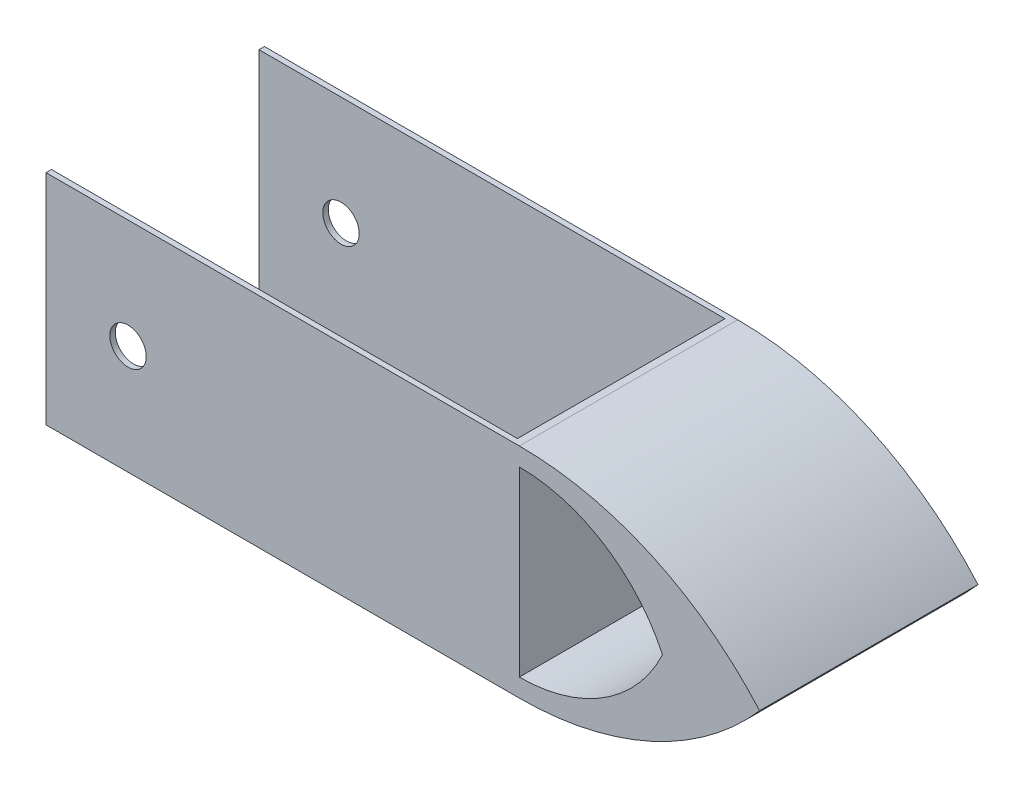
ISO-10303-21;
HEADER;
FILE_DESCRIPTION(('STEP AP214'),'2;1');
FILE_NAME('part.step','',(''),(''),'','','');
FILE_SCHEMA(('AUTOMOTIVE_DESIGN { 1 0 10303 214 1 1 1 1 }'));
ENDSEC;
DATA;
#1=APPLICATION_CONTEXT('core data for automotive mechanical design processes');
#2=APPLICATION_PROTOCOL_DEFINITION('international standard','automotive_design',2000,#1);
#3=PRODUCT_CONTEXT('',#1,'mechanical');
#4=PRODUCT('Part','Part','',(#3));
#5=PRODUCT_RELATED_PRODUCT_CATEGORY('part','',(#4));
#6=PRODUCT_DEFINITION_FORMATION('','',#4);
#7=PRODUCT_DEFINITION_CONTEXT('part definition',#1,'design');
#8=PRODUCT_DEFINITION('design','',#6,#7);
#9=PRODUCT_DEFINITION_SHAPE('','',#8);
#10=(LENGTH_UNIT() NAMED_UNIT(*) SI_UNIT(.MILLI.,.METRE.));
#11=(NAMED_UNIT(*) PLANE_ANGLE_UNIT() SI_UNIT($,.RADIAN.));
#12=(NAMED_UNIT(*) SI_UNIT($,.STERADIAN.) SOLID_ANGLE_UNIT());
#13=UNCERTAINTY_MEASURE_WITH_UNIT(LENGTH_MEASURE(1.E-05),#10,'distance_accuracy_value','');
#14=(GEOMETRIC_REPRESENTATION_CONTEXT(3) GLOBAL_UNCERTAINTY_ASSIGNED_CONTEXT((#13)) GLOBAL_UNIT_ASSIGNED_CONTEXT((#10,
#11,#12)) REPRESENTATION_CONTEXT('',''));
#15=CARTESIAN_POINT('',(0.,0.,0.));
#16=DIRECTION('',(0.,0.,1.));
#17=DIRECTION('',(1.,0.,0.));
#18=AXIS2_PLACEMENT_3D('',#15,#16,#17);
#19=CARTESIAN_POINT('',(-65.,30.,60.));
#20=DIRECTION('',(1.,0.,0.));
#21=DIRECTION('',(0.,1.,0.));
#22=AXIS2_PLACEMENT_3D('',#19,#20,#21);
#23=PLANE('',#22);
#24=DIRECTION('',(0.,0.,-1.));
#25=VECTOR('',#24,1.);
#26=CARTESIAN_POINT('',(-65.,-30.,60.));
#27=LINE('',#26,#25);
#28=CARTESIAN_POINT('',(-65.,-30.,1.50000000000002));
#29=VERTEX_POINT('',#28);
#30=CARTESIAN_POINT('',(-65.,-30.,0.));
#31=VERTEX_POINT('',#30);
#32=EDGE_CURVE('E178',#29,#31,#27,.T.);
#33=ORIENTED_EDGE('',*,*,#32,.F.);
#34=DIRECTION('',(0.,1.,0.));
#35=VECTOR('',#34,1.);
#36=CARTESIAN_POINT('',(-65.,30.,1.50000000000002));
#37=LINE('',#36,#35);
#38=CARTESIAN_POINT('',(-65.,30.,1.50000000000002));
#39=VERTEX_POINT('',#38);
#40=EDGE_CURVE('E133',#29,#39,#37,.T.);
#41=ORIENTED_EDGE('',*,*,#40,.T.);
#42=DIRECTION('',(0.,0.,-1.));
#43=VECTOR('',#42,1.);
#44=CARTESIAN_POINT('',(-65.,30.,60.));
#45=LINE('',#44,#43);
#46=CARTESIAN_POINT('',(-65.,30.,0.));
#47=VERTEX_POINT('',#46);
#48=EDGE_CURVE('E126',#39,#47,#45,.T.);
#49=ORIENTED_EDGE('',*,*,#48,.T.);
#50=DIRECTION('',(0.,-1.,0.));
#51=VECTOR('',#50,1.);
#52=CARTESIAN_POINT('',(-65.,30.,0.));
#53=LINE('',#52,#51);
#54=EDGE_CURVE('E130',#47,#31,#53,.T.);
#55=ORIENTED_EDGE('',*,*,#54,.T.);
#56=EDGE_LOOP('',(#33,#41,#49,#55));
#57=FACE_BOUND('',#56,.T.);
#58=ADVANCED_FACE('F38',(#57),#23,.F.);
#59=CARTESIAN_POINT('',(-65.,30.,60.));
#60=VERTEX_POINT('',#59);
#61=CARTESIAN_POINT('',(-65.,30.,58.5));
#62=VERTEX_POINT('',#61);
#63=EDGE_CURVE('E137',#60,#62,#45,.T.);
#64=ORIENTED_EDGE('',*,*,#63,.T.);
#65=DIRECTION('',(0.,-1.,0.));
#66=VECTOR('',#65,1.);
#67=CARTESIAN_POINT('',(-65.,30.,58.5));
#68=LINE('',#67,#66);
#69=CARTESIAN_POINT('',(-65.,-30.,58.5));
#70=VERTEX_POINT('',#69);
#71=EDGE_CURVE('E243',#62,#70,#68,.T.);
#72=ORIENTED_EDGE('',*,*,#71,.T.);
#73=CARTESIAN_POINT('',(-65.,-30.,60.));
#74=VERTEX_POINT('',#73);
#75=EDGE_CURVE('E179',#74,#70,#27,.T.);
#76=ORIENTED_EDGE('',*,*,#75,.F.);
#77=DIRECTION('',(0.,-1.,0.));
#78=VECTOR('',#77,1.);
#79=CARTESIAN_POINT('',(-65.,30.,60.));
#80=LINE('',#79,#78);
#81=EDGE_CURVE('E147',#60,#74,#80,.T.);
#82=ORIENTED_EDGE('',*,*,#81,.F.);
#83=EDGE_LOOP('',(#64,#72,#76,#82));
#84=FACE_BOUND('',#83,.T.);
#85=ADVANCED_FACE('F40',(#84),#23,.F.);
#86=CARTESIAN_POINT('',(65.,-30.,60.));
#87=DIRECTION('',(0.,1.,0.));
#88=DIRECTION('',(-1.,0.,0.));
#89=AXIS2_PLACEMENT_3D('',#86,#87,#88);
#90=PLANE('',#89);
#91=DIRECTION('',(-1.,0.,0.));
#92=VECTOR('',#91,1.);
#93=CARTESIAN_POINT('',(63.,-30.,1.5));
#94=LINE('',#93,#92);
#95=CARTESIAN_POINT('',(63.,-30.,1.5));
#96=VERTEX_POINT('',#95);
#97=EDGE_CURVE('E267',#96,#29,#94,.T.);
#98=ORIENTED_EDGE('',*,*,#97,.T.);
#99=ORIENTED_EDGE('',*,*,#32,.T.);
#100=DIRECTION('',(1.,0.,0.));
#101=VECTOR('',#100,1.);
#102=CARTESIAN_POINT('',(65.,-30.,0.));
#103=LINE('',#102,#101);
#104=CARTESIAN_POINT('',(65.,-30.,0.));
#105=VERTEX_POINT('',#104);
#106=EDGE_CURVE('E152',#31,#105,#103,.T.);
#107=ORIENTED_EDGE('',*,*,#106,.T.);
#108=DIRECTION('',(0.,0.,-1.));
#109=VECTOR('',#108,1.);
#110=CARTESIAN_POINT('',(65.,-30.,60.));
#111=LINE('',#110,#109);
#112=CARTESIAN_POINT('',(65.,-30.,60.));
#113=VERTEX_POINT('',#112);
#114=EDGE_CURVE('E174',#113,#105,#111,.T.);
#115=ORIENTED_EDGE('',*,*,#114,.F.);
#116=DIRECTION('',(1.,0.,0.));
#117=VECTOR('',#116,1.);
#118=CARTESIAN_POINT('',(65.,-30.,60.));
#119=LINE('',#118,#117);
#120=EDGE_CURVE('E222',#74,#113,#119,.T.);
#121=ORIENTED_EDGE('',*,*,#120,.F.);
#122=ORIENTED_EDGE('',*,*,#75,.T.);
#123=DIRECTION('',(1.,0.,0.));
#124=VECTOR('',#123,1.);
#125=CARTESIAN_POINT('',(63.,-30.,58.5));
#126=LINE('',#125,#124);
#127=CARTESIAN_POINT('',(63.,-30.,58.5));
#128=VERTEX_POINT('',#127);
#129=EDGE_CURVE('E249',#70,#128,#126,.T.);
#130=ORIENTED_EDGE('',*,*,#129,.T.);
#131=DIRECTION('',(0.,0.,-1.));
#132=VECTOR('',#131,1.);
#133=CARTESIAN_POINT('',(63.,-30.,1.5));
#134=LINE('',#133,#132);
#135=EDGE_CURVE('E56',#128,#96,#134,.T.);
#136=ORIENTED_EDGE('',*,*,#135,.T.);
#137=EDGE_LOOP('',(#98,#99,#107,#115,#121,#122,#130,#136));
#138=FACE_BOUND('',#137,.T.);
#139=ADVANCED_FACE('F247',(#138),#90,.F.);
#140=CARTESIAN_POINT('',(65.,57.5848954122928,60.));
#141=DIRECTION('',(0.,0.,-1.));
#142=DIRECTION('',(-1.,0.,0.));
#143=AXIS2_PLACEMENT_3D('',#140,#141,#142);
#144=CYLINDRICAL_SURFACE('',#143,87.5848954122928);
#145=CARTESIAN_POINT('',(65.,57.5848954122928,0.));
#146=DIRECTION('',(0.,0.,1.));
#147=DIRECTION('',(1.,0.,0.));
#148=AXIS2_PLACEMENT_3D('',#145,#146,#147);
#149=CIRCLE('',#148,87.5848954122928);
#150=CARTESIAN_POINT('',(130.993133921171,0.,0.));
#151=VERTEX_POINT('',#150);
#152=EDGE_CURVE('E157',#105,#151,#149,.T.);
#153=ORIENTED_EDGE('',*,*,#152,.T.);
#154=DIRECTION('',(0.,0.,-1.));
#155=VECTOR('',#154,1.);
#156=CARTESIAN_POINT('',(130.993133921171,0.,60.));
#157=LINE('',#156,#155);
#158=CARTESIAN_POINT('',(130.993133921171,0.,60.));
#159=VERTEX_POINT('',#158);
#160=EDGE_CURVE('E171',#159,#151,#157,.T.);
#161=ORIENTED_EDGE('',*,*,#160,.F.);
#162=CARTESIAN_POINT('',(65.,57.5848954122928,60.));
#163=DIRECTION('',(0.,0.,1.));
#164=DIRECTION('',(1.,0.,0.));
#165=AXIS2_PLACEMENT_3D('',#162,#163,#164);
#166=CIRCLE('',#165,87.5848954122928);
#167=EDGE_CURVE('E225',#113,#159,#166,.T.);
#168=ORIENTED_EDGE('',*,*,#167,.F.);
#169=ORIENTED_EDGE('',*,*,#114,.T.);
#170=EDGE_LOOP('',(#153,#161,#168,#169));
#171=FACE_BOUND('',#170,.T.);
#172=ADVANCED_FACE('F328',(#171),#144,.T.);
#173=CARTESIAN_POINT('',(65.,-57.5848954122928,60.));
#174=DIRECTION('',(0.,0.,-1.));
#175=DIRECTION('',(-1.,0.,0.));
#176=AXIS2_PLACEMENT_3D('',#173,#174,#175);
#177=CYLINDRICAL_SURFACE('',#176,87.5848954122928);
#178=CARTESIAN_POINT('',(65.,-57.5848954122928,0.));
#179=DIRECTION('',(0.,0.,1.));
#180=DIRECTION('',(-1.,0.,0.));
#181=AXIS2_PLACEMENT_3D('',#178,#179,#180);
#182=CIRCLE('',#181,87.5848954122928);
#183=CARTESIAN_POINT('',(65.,30.,0.));
#184=VERTEX_POINT('',#183);
#185=EDGE_CURVE('E119',#151,#184,#182,.T.);
#186=ORIENTED_EDGE('',*,*,#185,.T.);
#187=DIRECTION('',(0.,0.,-1.));
#188=VECTOR('',#187,1.);
#189=CARTESIAN_POINT('',(65.,30.,60.));
#190=LINE('',#189,#188);
#191=CARTESIAN_POINT('',(65.,30.,60.));
#192=VERTEX_POINT('',#191);
#193=EDGE_CURVE('E144',#192,#184,#190,.T.);
#194=ORIENTED_EDGE('',*,*,#193,.F.);
#195=CARTESIAN_POINT('',(65.,-57.5848954122928,60.));
#196=DIRECTION('',(0.,0.,1.));
#197=DIRECTION('',(-1.,0.,0.));
#198=AXIS2_PLACEMENT_3D('',#195,#196,#197);
#199=CIRCLE('',#198,87.5848954122928);
#200=EDGE_CURVE('E227',#159,#192,#199,.T.);
#201=ORIENTED_EDGE('',*,*,#200,.F.);
#202=ORIENTED_EDGE('',*,*,#160,.T.);
#203=EDGE_LOOP('',(#186,#194,#201,#202));
#204=FACE_BOUND('',#203,.T.);
#205=ADVANCED_FACE('F333',(#204),#177,.T.);
#206=CARTESIAN_POINT('',(65.,30.,60.));
#207=DIRECTION('',(0.,-1.,0.));
#208=DIRECTION('',(1.,0.,0.));
#209=AXIS2_PLACEMENT_3D('',#206,#207,#208);
#210=PLANE('',#209);
#211=ORIENTED_EDGE('',*,*,#48,.F.);
#212=DIRECTION('',(-1.,0.,0.));
#213=VECTOR('',#212,1.);
#214=CARTESIAN_POINT('',(63.,30.,1.5));
#215=LINE('',#214,#213);
#216=CARTESIAN_POINT('',(63.,30.,1.5));
#217=VERTEX_POINT('',#216);
#218=EDGE_CURVE('E274',#217,#39,#215,.T.);
#219=ORIENTED_EDGE('',*,*,#218,.F.);
#220=DIRECTION('',(0.,0.,-1.));
#221=VECTOR('',#220,1.);
#222=CARTESIAN_POINT('',(63.,30.,1.5));
#223=LINE('',#222,#221);
#224=CARTESIAN_POINT('',(63.,30.,58.5));
#225=VERTEX_POINT('',#224);
#226=EDGE_CURVE('E264',#225,#217,#223,.T.);
#227=ORIENTED_EDGE('',*,*,#226,.F.);
#228=DIRECTION('',(1.,0.,0.));
#229=VECTOR('',#228,1.);
#230=CARTESIAN_POINT('',(63.,30.,58.5));
#231=LINE('',#230,#229);
#232=EDGE_CURVE('E238',#62,#225,#231,.T.);
#233=ORIENTED_EDGE('',*,*,#232,.F.);
#234=ORIENTED_EDGE('',*,*,#63,.F.);
#235=DIRECTION('',(-1.,0.,0.));
#236=VECTOR('',#235,1.);
#237=CARTESIAN_POINT('',(65.,30.,60.));
#238=LINE('',#237,#236);
#239=EDGE_CURVE('E138',#192,#60,#238,.T.);
#240=ORIENTED_EDGE('',*,*,#239,.F.);
#241=ORIENTED_EDGE('',*,*,#193,.T.);
#242=DIRECTION('',(-1.,0.,0.));
#243=VECTOR('',#242,1.);
#244=CARTESIAN_POINT('',(65.,30.,0.));
#245=LINE('',#244,#243);
#246=EDGE_CURVE('E141',#184,#47,#245,.T.);
#247=ORIENTED_EDGE('',*,*,#246,.T.);
#248=EDGE_LOOP('',(#211,#219,#227,#233,#234,#240,#241,#247));
#249=FACE_BOUND('',#248,.T.);
#250=ADVANCED_FACE('F142',(#249),#210,.F.);
#251=CARTESIAN_POINT('',(65.,57.5848954122928,60.));
#252=DIRECTION('',(0.,0.,1.));
#253=DIRECTION('',(1.,0.,0.));
#254=AXIS2_PLACEMENT_3D('',#251,#252,#253);
#255=PLANE('',#254);
#256=CARTESIAN_POINT('',(-42.4670371060077,0.,60.));
#257=DIRECTION('',(0.,0.,1.));
#258=DIRECTION('',(1.,0.,0.));
#259=AXIS2_PLACEMENT_3D('',#256,#257,#258);
#260=CIRCLE('',#259,5.);
#261=CARTESIAN_POINT('',(-37.4670371060077,0.,60.));
#262=VERTEX_POINT('',#261);
#263=EDGE_CURVE('E295',#262,#262,#260,.T.);
#264=ORIENTED_EDGE('',*,*,#263,.F.);
#265=EDGE_LOOP('',(#264));
#266=FACE_BOUND('',#265,.T.);
#267=CARTESIAN_POINT('',(65.,-18.4515973099155,60.));
#268=DIRECTION('',(0.,0.,1.));
#269=DIRECTION('',(-1.,0.,0.));
#270=AXIS2_PLACEMENT_3D('',#267,#268,#269);
#271=CIRCLE('',#270,43.4515973099155);
#272=CARTESIAN_POINT('',(104.339291624224,0.,60.));
#273=VERTEX_POINT('',#272);
#274=CARTESIAN_POINT('',(65.,25.,60.));
#275=VERTEX_POINT('',#274);
#276=EDGE_CURVE('E201',#273,#275,#271,.T.);
#277=ORIENTED_EDGE('',*,*,#276,.F.);
#278=CARTESIAN_POINT('',(64.9999999999999,18.4515973099155,60.));
#279=DIRECTION('',(0.,0.,1.));
#280=DIRECTION('',(1.,0.,0.));
#281=AXIS2_PLACEMENT_3D('',#278,#279,#280);
#282=CIRCLE('',#281,43.4515973099155);
#283=CARTESIAN_POINT('',(65.,-25.,60.));
#284=VERTEX_POINT('',#283);
#285=EDGE_CURVE('E193',#284,#273,#282,.T.);
#286=ORIENTED_EDGE('',*,*,#285,.F.);
#287=DIRECTION('',(0.,-1.,0.));
#288=VECTOR('',#287,1.);
#289=CARTESIAN_POINT('',(65.,25.,60.));
#290=LINE('',#289,#288);
#291=EDGE_CURVE('E199',#275,#284,#290,.T.);
#292=ORIENTED_EDGE('',*,*,#291,.F.);
#293=EDGE_LOOP('',(#277,#286,#292));
#294=FACE_BOUND('',#293,.T.);
#295=ORIENTED_EDGE('',*,*,#81,.T.);
#296=ORIENTED_EDGE('',*,*,#120,.T.);
#297=ORIENTED_EDGE('',*,*,#167,.T.);
#298=ORIENTED_EDGE('',*,*,#200,.T.);
#299=ORIENTED_EDGE('',*,*,#239,.T.);
#300=EDGE_LOOP('',(#295,#296,#297,#298,#299));
#301=FACE_BOUND('',#300,.T.);
#302=ADVANCED_FACE('F202',(#266,#294,#301),#255,.T.);
#303=CARTESIAN_POINT('',(65.,57.5848954122928,0.));
#304=DIRECTION('',(0.,0.,1.));
#305=DIRECTION('',(1.,0.,0.));
#306=AXIS2_PLACEMENT_3D('',#303,#304,#305);
#307=PLANE('',#306);
#308=CARTESIAN_POINT('',(-42.4670371060077,0.,0.));
#309=DIRECTION('',(0.,0.,1.));
#310=DIRECTION('',(1.,0.,0.));
#311=AXIS2_PLACEMENT_3D('',#308,#309,#310);
#312=CIRCLE('',#311,5.);
#313=CARTESIAN_POINT('',(-37.4670371060077,0.,0.));
#314=VERTEX_POINT('',#313);
#315=EDGE_CURVE('E287',#314,#314,#312,.F.);
#316=ORIENTED_EDGE('',*,*,#315,.F.);
#317=EDGE_LOOP('',(#316));
#318=FACE_BOUND('',#317,.T.);
#319=CARTESIAN_POINT('',(64.9999999999999,18.4515973099155,0.));
#320=DIRECTION('',(0.,0.,1.));
#321=DIRECTION('',(1.,0.,0.));
#322=AXIS2_PLACEMENT_3D('',#319,#320,#321);
#323=CIRCLE('',#322,43.4515973099155);
#324=CARTESIAN_POINT('',(65.,-25.,0.));
#325=VERTEX_POINT('',#324);
#326=CARTESIAN_POINT('',(104.339291624224,0.,0.));
#327=VERTEX_POINT('',#326);
#328=EDGE_CURVE('E48',#325,#327,#323,.T.);
#329=ORIENTED_EDGE('',*,*,#328,.T.);
#330=CARTESIAN_POINT('',(65.,-18.4515973099155,0.));
#331=DIRECTION('',(0.,0.,1.));
#332=DIRECTION('',(1.,0.,0.));
#333=AXIS2_PLACEMENT_3D('',#330,#331,#332);
#334=CIRCLE('',#333,43.4515973099155);
#335=CARTESIAN_POINT('',(65.,25.,0.));
#336=VERTEX_POINT('',#335);
#337=EDGE_CURVE('E11',#327,#336,#334,.T.);
#338=ORIENTED_EDGE('',*,*,#337,.T.);
#339=DIRECTION('',(0.,1.,0.));
#340=VECTOR('',#339,1.);
#341=CARTESIAN_POINT('',(65.,57.5848954122928,0.));
#342=LINE('',#341,#340);
#343=EDGE_CURVE('E77',#336,#325,#342,.F.);
#344=ORIENTED_EDGE('',*,*,#343,.T.);
#345=EDGE_LOOP('',(#329,#338,#344));
#346=FACE_BOUND('',#345,.T.);
#347=ORIENTED_EDGE('',*,*,#54,.F.);
#348=ORIENTED_EDGE('',*,*,#246,.F.);
#349=ORIENTED_EDGE('',*,*,#185,.F.);
#350=ORIENTED_EDGE('',*,*,#152,.F.);
#351=ORIENTED_EDGE('',*,*,#106,.F.);
#352=EDGE_LOOP('',(#347,#348,#349,#350,#351));
#353=FACE_BOUND('',#352,.T.);
#354=ADVANCED_FACE('F150',(#318,#346,#353),#307,.F.);
#355=CARTESIAN_POINT('',(65.,-18.4515973099155,-1.2E-05));
#356=DIRECTION('',(0.,0.,1.));
#357=DIRECTION('',(1.,0.,0.));
#358=AXIS2_PLACEMENT_3D('',#355,#356,#357);
#359=CYLINDRICAL_SURFACE('',#358,43.4515973099155);
#360=DIRECTION('',(0.,0.,1.));
#361=VECTOR('',#360,1.);
#362=CARTESIAN_POINT('',(104.339291624224,0.,-1.2E-05));
#363=LINE('',#362,#361);
#364=EDGE_CURVE('E86',#327,#273,#363,.T.);
#365=ORIENTED_EDGE('',*,*,#364,.T.);
#366=ORIENTED_EDGE('',*,*,#276,.T.);
#367=DIRECTION('',(0.,0.,-1.));
#368=VECTOR('',#367,1.);
#369=CARTESIAN_POINT('',(65.,25.,60.));
#370=LINE('',#369,#368);
#371=EDGE_CURVE('E65',#275,#336,#370,.T.);
#372=ORIENTED_EDGE('',*,*,#371,.T.);
#373=ORIENTED_EDGE('',*,*,#337,.F.);
#374=EDGE_LOOP('',(#365,#366,#372,#373));
#375=FACE_BOUND('',#374,.T.);
#376=ADVANCED_FACE('F188',(#375),#359,.F.);
#377=CARTESIAN_POINT('',(64.9999999999999,18.4515973099155,-1.2E-05));
#378=DIRECTION('',(0.,0.,1.));
#379=DIRECTION('',(1.,0.,0.));
#380=AXIS2_PLACEMENT_3D('',#377,#378,#379);
#381=CYLINDRICAL_SURFACE('',#380,43.4515973099155);
#382=DIRECTION('',(0.,0.,-1.));
#383=VECTOR('',#382,1.);
#384=CARTESIAN_POINT('',(65.,-25.,60.));
#385=LINE('',#384,#383);
#386=EDGE_CURVE('E195',#284,#325,#385,.T.);
#387=ORIENTED_EDGE('',*,*,#386,.F.);
#388=ORIENTED_EDGE('',*,*,#285,.T.);
#389=ORIENTED_EDGE('',*,*,#364,.F.);
#390=ORIENTED_EDGE('',*,*,#328,.F.);
#391=EDGE_LOOP('',(#387,#388,#389,#390));
#392=FACE_BOUND('',#391,.T.);
#393=ADVANCED_FACE('F191',(#392),#381,.F.);
#394=CARTESIAN_POINT('',(65.,25.,-1.2E-05));
#395=DIRECTION('',(-1.,0.,0.));
#396=DIRECTION('',(0.,0.,1.));
#397=AXIS2_PLACEMENT_3D('',#394,#395,#396);
#398=PLANE('',#397);
#399=ORIENTED_EDGE('',*,*,#371,.F.);
#400=ORIENTED_EDGE('',*,*,#291,.T.);
#401=ORIENTED_EDGE('',*,*,#386,.T.);
#402=ORIENTED_EDGE('',*,*,#343,.F.);
#403=EDGE_LOOP('',(#399,#400,#401,#402));
#404=FACE_BOUND('',#403,.T.);
#405=ADVANCED_FACE('F348',(#404),#398,.F.);
#406=CARTESIAN_POINT('',(63.,-30.,1.5));
#407=DIRECTION('',(0.,0.,-1.));
#408=DIRECTION('',(-1.,0.,0.));
#409=AXIS2_PLACEMENT_3D('',#406,#407,#408);
#410=PLANE('',#409);
#411=CARTESIAN_POINT('',(-42.4670371060077,0.,1.50000000000002));
#412=DIRECTION('',(0.,0.,-1.));
#413=DIRECTION('',(-1.,0.,0.));
#414=AXIS2_PLACEMENT_3D('',#411,#412,#413);
#415=CIRCLE('',#414,5.);
#416=CARTESIAN_POINT('',(-47.4670371060077,0.,1.50000000000002));
#417=VERTEX_POINT('',#416);
#418=EDGE_CURVE('E291',#417,#417,#415,.F.);
#419=ORIENTED_EDGE('',*,*,#418,.F.);
#420=EDGE_LOOP('',(#419));
#421=FACE_BOUND('',#420,.T.);
#422=ORIENTED_EDGE('',*,*,#218,.T.);
#423=ORIENTED_EDGE('',*,*,#40,.F.);
#424=ORIENTED_EDGE('',*,*,#97,.F.);
#425=DIRECTION('',(0.,1.,0.));
#426=VECTOR('',#425,1.);
#427=CARTESIAN_POINT('',(63.,-30.,1.5));
#428=LINE('',#427,#426);
#429=EDGE_CURVE('E205',#96,#217,#428,.T.);
#430=ORIENTED_EDGE('',*,*,#429,.T.);
#431=EDGE_LOOP('',(#422,#423,#424,#430));
#432=FACE_BOUND('',#431,.T.);
#433=ADVANCED_FACE('F268',(#421,#432),#410,.F.);
#434=CARTESIAN_POINT('',(63.,-30.,1.5));
#435=DIRECTION('',(1.,0.,0.));
#436=DIRECTION('',(0.,0.,-1.));
#437=AXIS2_PLACEMENT_3D('',#434,#435,#436);
#438=PLANE('',#437);
#439=ORIENTED_EDGE('',*,*,#429,.F.);
#440=ORIENTED_EDGE('',*,*,#135,.F.);
#441=DIRECTION('',(0.,1.,0.));
#442=VECTOR('',#441,1.);
#443=CARTESIAN_POINT('',(63.,-30.,58.5));
#444=LINE('',#443,#442);
#445=EDGE_CURVE('E211',#128,#225,#444,.T.);
#446=ORIENTED_EDGE('',*,*,#445,.T.);
#447=ORIENTED_EDGE('',*,*,#226,.T.);
#448=EDGE_LOOP('',(#439,#440,#446,#447));
#449=FACE_BOUND('',#448,.T.);
#450=ADVANCED_FACE('F263',(#449),#438,.F.);
#451=CARTESIAN_POINT('',(63.,-30.,58.5));
#452=DIRECTION('',(0.,0.,1.));
#453=DIRECTION('',(1.,0.,0.));
#454=AXIS2_PLACEMENT_3D('',#451,#452,#453);
#455=PLANE('',#454);
#456=CARTESIAN_POINT('',(-42.4670371060077,0.,58.5));
#457=DIRECTION('',(0.,0.,1.));
#458=DIRECTION('',(1.,0.,0.));
#459=AXIS2_PLACEMENT_3D('',#456,#457,#458);
#460=CIRCLE('',#459,5.);
#461=CARTESIAN_POINT('',(-37.4670371060077,0.,58.5));
#462=VERTEX_POINT('',#461);
#463=EDGE_CURVE('E42',#462,#462,#460,.F.);
#464=ORIENTED_EDGE('',*,*,#463,.F.);
#465=EDGE_LOOP('',(#464));
#466=FACE_BOUND('',#465,.T.);
#467=ORIENTED_EDGE('',*,*,#445,.F.);
#468=ORIENTED_EDGE('',*,*,#129,.F.);
#469=ORIENTED_EDGE('',*,*,#71,.F.);
#470=ORIENTED_EDGE('',*,*,#232,.T.);
#471=EDGE_LOOP('',(#467,#468,#469,#470));
#472=FACE_BOUND('',#471,.T.);
#473=ADVANCED_FACE('F306',(#466,#472),#455,.F.);
#474=CARTESIAN_POINT('',(-42.4670371060077,0.,60.));
#475=DIRECTION('',(0.,0.,-1.));
#476=DIRECTION('',(-1.,0.,0.));
#477=AXIS2_PLACEMENT_3D('',#474,#475,#476);
#478=CYLINDRICAL_SURFACE('',#477,5.);
#479=ORIENTED_EDGE('',*,*,#263,.T.);
#480=EDGE_LOOP('',(#479));
#481=FACE_BOUND('',#480,.T.);
#482=ORIENTED_EDGE('',*,*,#463,.T.);
#483=EDGE_LOOP('',(#482));
#484=FACE_BOUND('',#483,.T.);
#485=ADVANCED_FACE('F304',(#481,#484),#478,.F.);
#486=ORIENTED_EDGE('',*,*,#418,.T.);
#487=EDGE_LOOP('',(#486));
#488=FACE_BOUND('',#487,.T.);
#489=ORIENTED_EDGE('',*,*,#315,.T.);
#490=EDGE_LOOP('',(#489));
#491=FACE_BOUND('',#490,.T.);
#492=ADVANCED_FACE('F315',(#488,#491),#478,.F.);
#493=CLOSED_SHELL('',(#58,#85,#139,#172,#205,#250,#302,#354,#376,#393,#405,#433,#450,#473,#485,#492));
#494=MANIFOLD_SOLID_BREP('B2',#493);
#495=ADVANCED_BREP_SHAPE_REPRESENTATION('',(#18,#494),#14);
#496=SHAPE_DEFINITION_REPRESENTATION(#9,#495);
ENDSEC;
END-ISO-10303-21;
